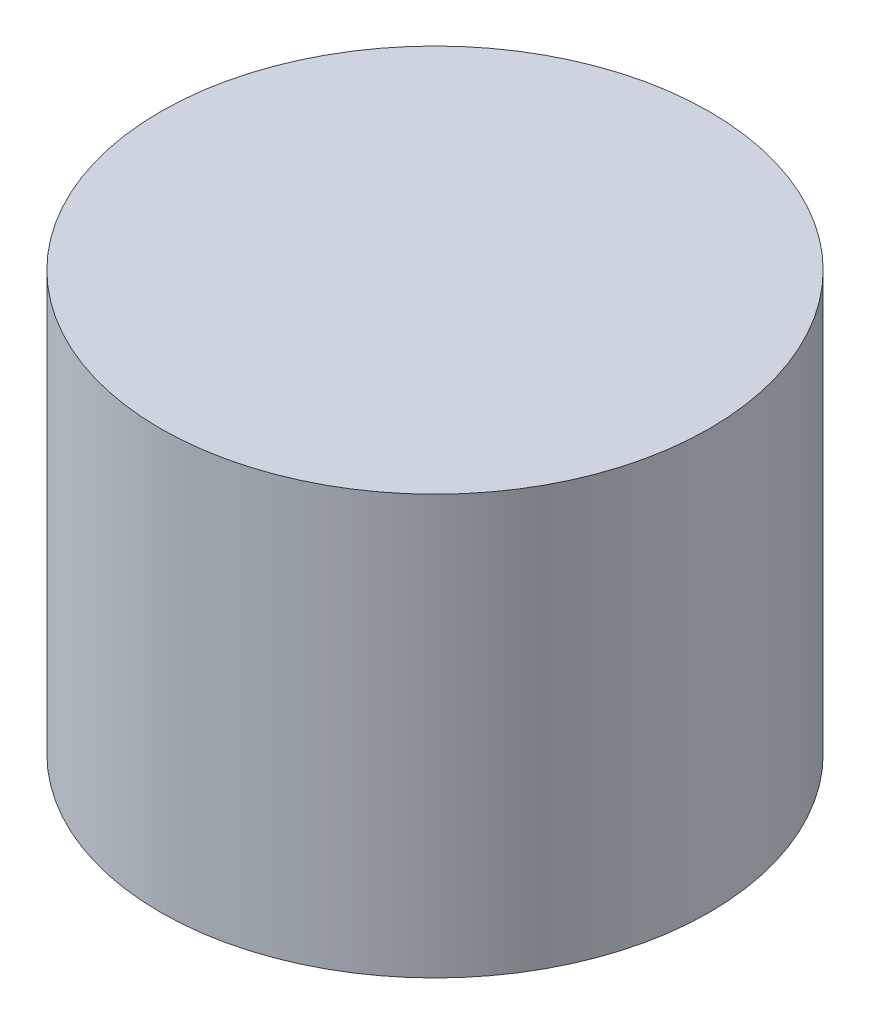
ISO-10303-21;
HEADER;
FILE_DESCRIPTION(('STEP AP214'),'2;1');
FILE_NAME('part.step','',(''),(''),'','','');
FILE_SCHEMA(('AUTOMOTIVE_DESIGN { 1 0 10303 214 1 1 1 1 }'));
ENDSEC;
DATA;
#1=APPLICATION_CONTEXT('core data for automotive mechanical design processes');
#2=APPLICATION_PROTOCOL_DEFINITION('international standard','automotive_design',2000,#1);
#3=PRODUCT_CONTEXT('',#1,'mechanical');
#4=PRODUCT('Part','Part','',(#3));
#5=PRODUCT_RELATED_PRODUCT_CATEGORY('part','',(#4));
#6=PRODUCT_DEFINITION_FORMATION('','',#4);
#7=PRODUCT_DEFINITION_CONTEXT('part definition',#1,'design');
#8=PRODUCT_DEFINITION('design','',#6,#7);
#9=PRODUCT_DEFINITION_SHAPE('','',#8);
#10=(LENGTH_UNIT() NAMED_UNIT(*) SI_UNIT(.MILLI.,.METRE.));
#11=(NAMED_UNIT(*) PLANE_ANGLE_UNIT() SI_UNIT($,.RADIAN.));
#12=(NAMED_UNIT(*) SI_UNIT($,.STERADIAN.) SOLID_ANGLE_UNIT());
#13=UNCERTAINTY_MEASURE_WITH_UNIT(LENGTH_MEASURE(1.E-05),#10,'distance_accuracy_value','');
#14=(GEOMETRIC_REPRESENTATION_CONTEXT(3) GLOBAL_UNCERTAINTY_ASSIGNED_CONTEXT((#13)) GLOBAL_UNIT_ASSIGNED_CONTEXT((#10,
#11,#12)) REPRESENTATION_CONTEXT('',''));
#15=CARTESIAN_POINT('',(0.,0.,0.));
#16=DIRECTION('',(0.,0.,1.));
#17=DIRECTION('',(1.,0.,0.));
#18=AXIS2_PLACEMENT_3D('',#15,#16,#17);
#19=CARTESIAN_POINT('',(0.,29.,0.));
#20=DIRECTION('',(0.,-1.,0.));
#21=DIRECTION('',(0.,0.,-1.));
#22=AXIS2_PLACEMENT_3D('',#19,#20,#21);
#23=CYLINDRICAL_SURFACE('',#22,19.);
#24=CARTESIAN_POINT('',(0.,29.,0.));
#25=DIRECTION('',(0.,1.,0.));
#26=DIRECTION('',(0.,0.,1.));
#27=AXIS2_PLACEMENT_3D('',#24,#25,#26);
#28=CIRCLE('',#27,19.);
#29=CARTESIAN_POINT('',(0.,29.,19.));
#30=VERTEX_POINT('',#29);
#31=EDGE_CURVE('E10',#30,#30,#28,.T.);
#32=ORIENTED_EDGE('',*,*,#31,.F.);
#33=EDGE_LOOP('',(#32));
#34=FACE_BOUND('',#33,.T.);
#35=CARTESIAN_POINT('',(0.,0.,0.));
#36=DIRECTION('',(0.,1.,0.));
#37=DIRECTION('',(0.,0.,1.));
#38=AXIS2_PLACEMENT_3D('',#35,#36,#37);
#39=CIRCLE('',#38,19.);
#40=CARTESIAN_POINT('',(0.,0.,19.));
#41=VERTEX_POINT('',#40);
#42=EDGE_CURVE('E36',#41,#41,#39,.T.);
#43=ORIENTED_EDGE('',*,*,#42,.T.);
#44=EDGE_LOOP('',(#43));
#45=FACE_BOUND('',#44,.T.);
#46=ADVANCED_FACE('F33',(#34,#45),#23,.T.);
#47=CARTESIAN_POINT('',(0.,29.,0.));
#48=DIRECTION('',(0.,1.,0.));
#49=DIRECTION('',(0.,0.,1.));
#50=AXIS2_PLACEMENT_3D('',#47,#48,#49);
#51=PLANE('',#50);
#52=ORIENTED_EDGE('',*,*,#31,.T.);
#53=EDGE_LOOP('',(#52));
#54=FACE_BOUND('',#53,.T.);
#55=ADVANCED_FACE('F52',(#54),#51,.T.);
#56=CARTESIAN_POINT('',(0.,0.,0.));
#57=DIRECTION('',(0.,1.,0.));
#58=DIRECTION('',(0.,0.,1.));
#59=AXIS2_PLACEMENT_3D('',#56,#57,#58);
#60=PLANE('',#59);
#61=ORIENTED_EDGE('',*,*,#42,.F.);
#62=EDGE_LOOP('',(#61));
#63=FACE_BOUND('',#62,.T.);
#64=ADVANCED_FACE('F50',(#63),#60,.F.);
#65=CLOSED_SHELL('',(#46,#55,#64));
#66=MANIFOLD_SOLID_BREP('B2',#65);
#67=ADVANCED_BREP_SHAPE_REPRESENTATION('',(#18,#66),#14);
#68=SHAPE_DEFINITION_REPRESENTATION(#9,#67);
ENDSEC;
END-ISO-10303-21;
